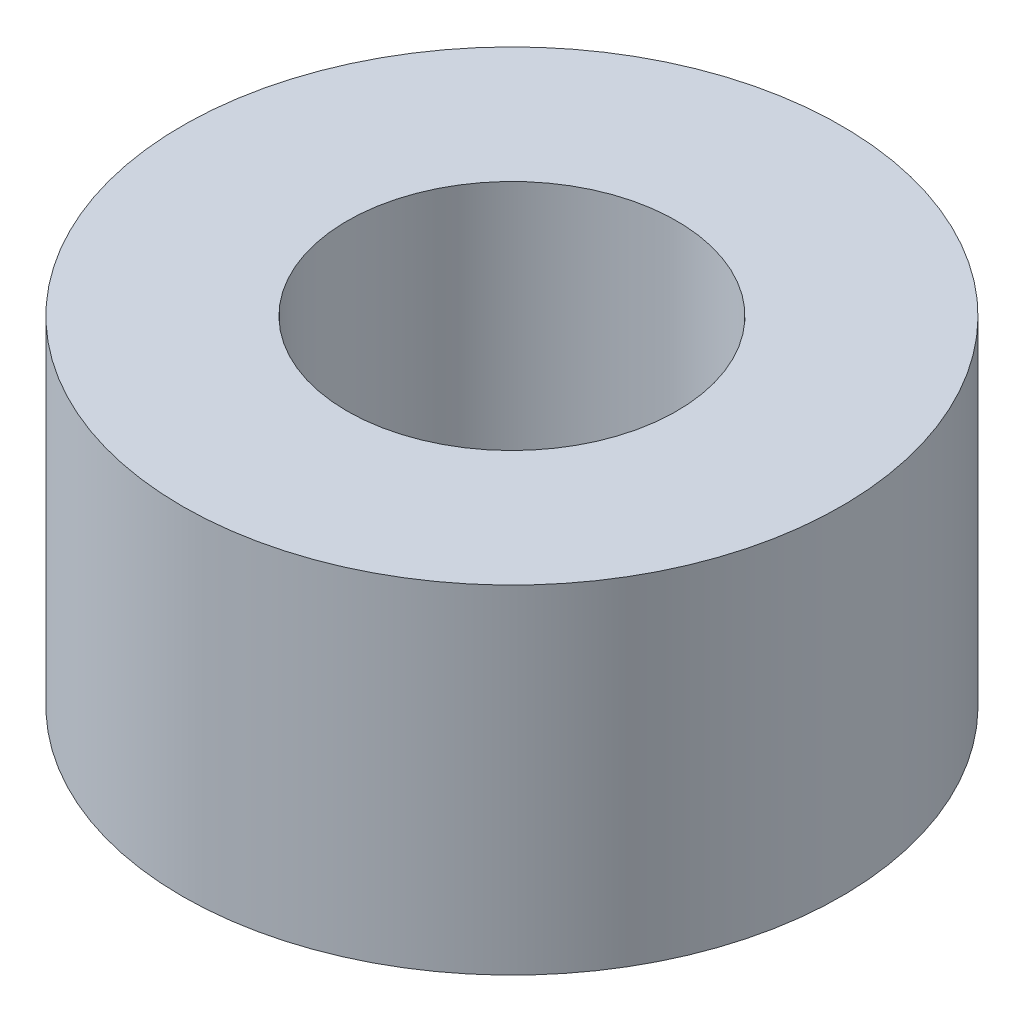
ISO-10303-21;
HEADER;
FILE_DESCRIPTION(('STEP AP214'),'2;1');
FILE_NAME('part.step','',(''),(''),'','','');
FILE_SCHEMA(('AUTOMOTIVE_DESIGN { 1 0 10303 214 1 1 1 1 }'));
ENDSEC;
DATA;
#1=APPLICATION_CONTEXT('core data for automotive mechanical design processes');
#2=APPLICATION_PROTOCOL_DEFINITION('international standard','automotive_design',2000,#1);
#3=PRODUCT_CONTEXT('',#1,'mechanical');
#4=PRODUCT('Part','Part','',(#3));
#5=PRODUCT_RELATED_PRODUCT_CATEGORY('part','',(#4));
#6=PRODUCT_DEFINITION_FORMATION('','',#4);
#7=PRODUCT_DEFINITION_CONTEXT('part definition',#1,'design');
#8=PRODUCT_DEFINITION('design','',#6,#7);
#9=PRODUCT_DEFINITION_SHAPE('','',#8);
#10=(LENGTH_UNIT() NAMED_UNIT(*) SI_UNIT(.MILLI.,.METRE.));
#11=(NAMED_UNIT(*) PLANE_ANGLE_UNIT() SI_UNIT($,.RADIAN.));
#12=(NAMED_UNIT(*) SI_UNIT($,.STERADIAN.) SOLID_ANGLE_UNIT());
#13=UNCERTAINTY_MEASURE_WITH_UNIT(LENGTH_MEASURE(1.E-05),#10,'distance_accuracy_value','');
#14=(GEOMETRIC_REPRESENTATION_CONTEXT(3) GLOBAL_UNCERTAINTY_ASSIGNED_CONTEXT((#13)) GLOBAL_UNIT_ASSIGNED_CONTEXT((#10,
#11,#12)) REPRESENTATION_CONTEXT('',''));
#15=CARTESIAN_POINT('',(0.,0.,0.));
#16=DIRECTION('',(0.,0.,1.));
#17=DIRECTION('',(1.,0.,0.));
#18=AXIS2_PLACEMENT_3D('',#15,#16,#17);
#19=CARTESIAN_POINT('',(0.,-4.1,0.));
#20=DIRECTION('',(0.,1.,0.));
#21=DIRECTION('',(0.,0.,1.));
#22=AXIS2_PLACEMENT_3D('',#19,#20,#21);
#23=CYLINDRICAL_SURFACE('',#22,4.);
#24=CARTESIAN_POINT('',(0.,-4.1,0.));
#25=DIRECTION('',(0.,1.,0.));
#26=DIRECTION('',(0.,0.,1.));
#27=AXIS2_PLACEMENT_3D('',#24,#25,#26);
#28=CIRCLE('',#27,4.);
#29=CARTESIAN_POINT('',(0.,-4.1,4.));
#30=VERTEX_POINT('',#29);
#31=EDGE_CURVE('E10',#30,#30,#28,.T.);
#32=ORIENTED_EDGE('',*,*,#31,.T.);
#33=EDGE_LOOP('',(#32));
#34=FACE_BOUND('',#33,.T.);
#35=CARTESIAN_POINT('',(0.,0.,0.));
#36=DIRECTION('',(0.,1.,0.));
#37=DIRECTION('',(0.,0.,1.));
#38=AXIS2_PLACEMENT_3D('',#35,#36,#37);
#39=CIRCLE('',#38,4.);
#40=CARTESIAN_POINT('',(0.,0.,4.));
#41=VERTEX_POINT('',#40);
#42=EDGE_CURVE('E34',#41,#41,#39,.T.);
#43=ORIENTED_EDGE('',*,*,#42,.F.);
#44=EDGE_LOOP('',(#43));
#45=FACE_BOUND('',#44,.T.);
#46=ADVANCED_FACE('F31',(#34,#45),#23,.T.);
#47=CARTESIAN_POINT('',(0.,-4.1,0.));
#48=DIRECTION('',(0.,1.,0.));
#49=DIRECTION('',(0.,0.,1.));
#50=AXIS2_PLACEMENT_3D('',#47,#48,#49);
#51=PLANE('',#50);
#52=CARTESIAN_POINT('',(0.,-4.1,0.));
#53=DIRECTION('',(0.,1.,0.));
#54=DIRECTION('',(0.,0.,1.));
#55=AXIS2_PLACEMENT_3D('',#52,#53,#54);
#56=CIRCLE('',#55,2.);
#57=CARTESIAN_POINT('',(0.,-4.1,2.));
#58=VERTEX_POINT('',#57);
#59=EDGE_CURVE('E41',#58,#58,#56,.T.);
#60=ORIENTED_EDGE('',*,*,#59,.T.);
#61=EDGE_LOOP('',(#60));
#62=FACE_BOUND('',#61,.T.);
#63=ORIENTED_EDGE('',*,*,#31,.F.);
#64=EDGE_LOOP('',(#63));
#65=FACE_BOUND('',#64,.T.);
#66=ADVANCED_FACE('F49',(#62,#65),#51,.F.);
#67=CARTESIAN_POINT('',(0.,0.,0.));
#68=DIRECTION('',(0.,1.,0.));
#69=DIRECTION('',(0.,0.,1.));
#70=AXIS2_PLACEMENT_3D('',#67,#68,#69);
#71=PLANE('',#70);
#72=CARTESIAN_POINT('',(0.,0.,0.));
#73=DIRECTION('',(0.,1.,0.));
#74=DIRECTION('',(0.,0.,1.));
#75=AXIS2_PLACEMENT_3D('',#72,#73,#74);
#76=CIRCLE('',#75,2.);
#77=CARTESIAN_POINT('',(0.,0.,2.));
#78=VERTEX_POINT('',#77);
#79=EDGE_CURVE('E43',#78,#78,#76,.T.);
#80=ORIENTED_EDGE('',*,*,#79,.F.);
#81=EDGE_LOOP('',(#80));
#82=FACE_BOUND('',#81,.T.);
#83=ORIENTED_EDGE('',*,*,#42,.T.);
#84=EDGE_LOOP('',(#83));
#85=FACE_BOUND('',#84,.T.);
#86=ADVANCED_FACE('F55',(#82,#85),#71,.T.);
#87=CARTESIAN_POINT('',(0.,-4.1,0.));
#88=DIRECTION('',(0.,1.,0.));
#89=DIRECTION('',(0.,0.,1.));
#90=AXIS2_PLACEMENT_3D('',#87,#88,#89);
#91=CYLINDRICAL_SURFACE('',#90,2.);
#92=ORIENTED_EDGE('',*,*,#59,.F.);
#93=EDGE_LOOP('',(#92));
#94=FACE_BOUND('',#93,.T.);
#95=ORIENTED_EDGE('',*,*,#79,.T.);
#96=EDGE_LOOP('',(#95));
#97=FACE_BOUND('',#96,.T.);
#98=ADVANCED_FACE('F52',(#94,#97),#91,.F.);
#99=CLOSED_SHELL('',(#46,#66,#86,#98));
#100=MANIFOLD_SOLID_BREP('B2',#99);
#101=ADVANCED_BREP_SHAPE_REPRESENTATION('',(#18,#100),#14);
#102=SHAPE_DEFINITION_REPRESENTATION(#9,#101);
ENDSEC;
END-ISO-10303-21;
